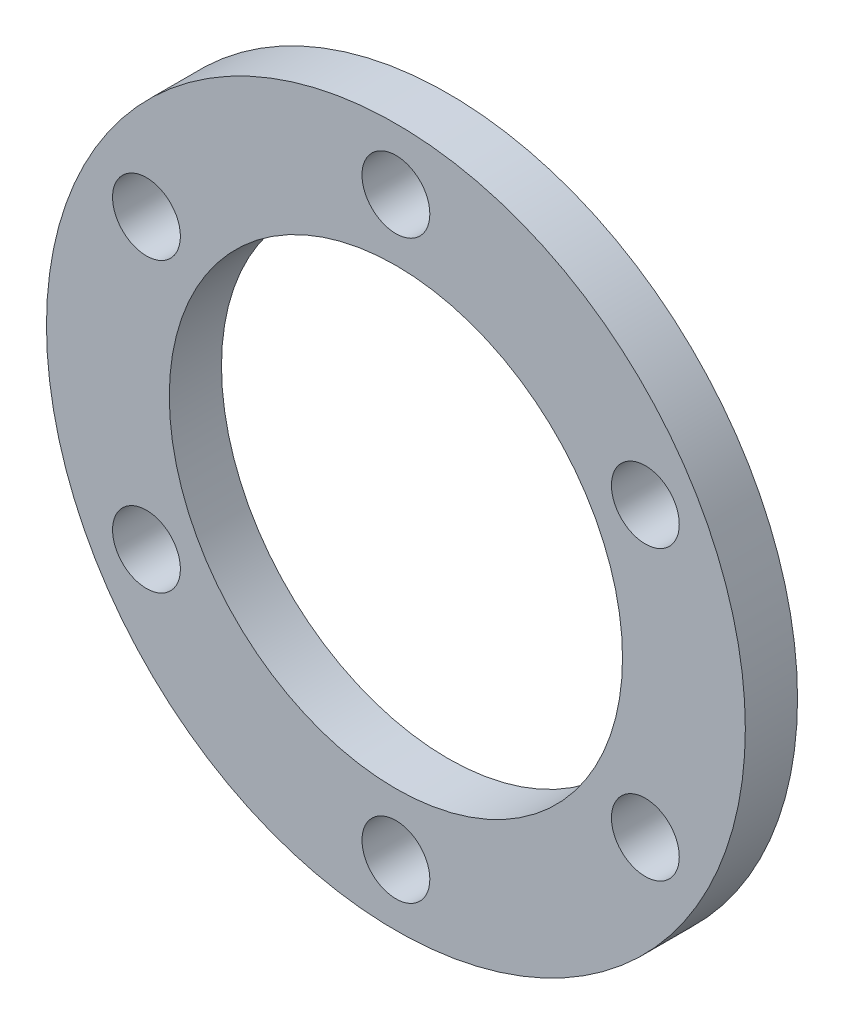
ISO-10303-21;
HEADER;
FILE_DESCRIPTION(('STEP AP214'),'2;1');
FILE_NAME('part.step','',(''),(''),'','','');
FILE_SCHEMA(('AUTOMOTIVE_DESIGN { 1 0 10303 214 1 1 1 1 }'));
ENDSEC;
DATA;
#1=APPLICATION_CONTEXT('core data for automotive mechanical design processes');
#2=APPLICATION_PROTOCOL_DEFINITION('international standard','automotive_design',2000,#1);
#3=PRODUCT_CONTEXT('',#1,'mechanical');
#4=PRODUCT('Part','Part','',(#3));
#5=PRODUCT_RELATED_PRODUCT_CATEGORY('part','',(#4));
#6=PRODUCT_DEFINITION_FORMATION('','',#4);
#7=PRODUCT_DEFINITION_CONTEXT('part definition',#1,'design');
#8=PRODUCT_DEFINITION('design','',#6,#7);
#9=PRODUCT_DEFINITION_SHAPE('','',#8);
#10=(LENGTH_UNIT() NAMED_UNIT(*) SI_UNIT(.MILLI.,.METRE.));
#11=(NAMED_UNIT(*) PLANE_ANGLE_UNIT() SI_UNIT($,.RADIAN.));
#12=(NAMED_UNIT(*) SI_UNIT($,.STERADIAN.) SOLID_ANGLE_UNIT());
#13=UNCERTAINTY_MEASURE_WITH_UNIT(LENGTH_MEASURE(1.E-05),#10,'distance_accuracy_value','');
#14=(GEOMETRIC_REPRESENTATION_CONTEXT(3) GLOBAL_UNCERTAINTY_ASSIGNED_CONTEXT((#13)) GLOBAL_UNIT_ASSIGNED_CONTEXT((#10,
#11,#12)) REPRESENTATION_CONTEXT('',''));
#15=CARTESIAN_POINT('',(0.,0.,0.));
#16=DIRECTION('',(0.,0.,1.));
#17=DIRECTION('',(1.,0.,0.));
#18=AXIS2_PLACEMENT_3D('',#15,#16,#17);
#19=CARTESIAN_POINT('',(0.,0.,4.318));
#20=DIRECTION('',(0.,0.,1.));
#21=DIRECTION('',(1.,0.,0.));
#22=AXIS2_PLACEMENT_3D('',#19,#20,#21);
#23=PLANE('',#22);
#24=CARTESIAN_POINT('',(-20.6332284502443,11.9125999999988,4.318));
#25=DIRECTION('',(0.,0.,1.));
#26=DIRECTION('',(1.,0.,0.));
#27=AXIS2_PLACEMENT_3D('',#24,#25,#26);
#28=CIRCLE('',#27,2.8067);
#29=CARTESIAN_POINT('',(-17.8265284502443,11.9125999999988,4.318));
#30=VERTEX_POINT('',#29);
#31=EDGE_CURVE('E72',#30,#30,#28,.T.);
#32=ORIENTED_EDGE('',*,*,#31,.F.);
#33=EDGE_LOOP('',(#32));
#34=FACE_BOUND('',#33,.T.);
#35=CARTESIAN_POINT('',(2.70277615510124E-12,-23.8252,4.318));
#36=DIRECTION('',(0.,0.,1.));
#37=DIRECTION('',(1.,0.,0.));
#38=AXIS2_PLACEMENT_3D('',#35,#36,#37);
#39=CIRCLE('',#38,2.8067);
#40=CARTESIAN_POINT('',(2.8067000000027,-23.8252,4.318));
#41=VERTEX_POINT('',#40);
#42=EDGE_CURVE('E60',#41,#41,#39,.T.);
#43=ORIENTED_EDGE('',*,*,#42,.F.);
#44=EDGE_LOOP('',(#43));
#45=FACE_BOUND('',#44,.T.);
#46=CARTESIAN_POINT('',(20.6332284502457,11.9126000000012,4.318));
#47=DIRECTION('',(0.,0.,1.));
#48=DIRECTION('',(1.,0.,0.));
#49=AXIS2_PLACEMENT_3D('',#46,#47,#48);
#50=CIRCLE('',#49,2.8067);
#51=CARTESIAN_POINT('',(23.4399284502457,11.9126000000012,4.318));
#52=VERTEX_POINT('',#51);
#53=EDGE_CURVE('E48',#52,#52,#50,.T.);
#54=ORIENTED_EDGE('',*,*,#53,.F.);
#55=EDGE_LOOP('',(#54));
#56=FACE_BOUND('',#55,.T.);
#57=CARTESIAN_POINT('',(0.,0.,4.318));
#58=DIRECTION('',(0.,0.,1.));
#59=DIRECTION('',(1.,0.,0.));
#60=AXIS2_PLACEMENT_3D('',#57,#58,#59);
#61=CIRCLE('',#60,28.9052);
#62=CARTESIAN_POINT('',(28.9052,0.,4.318));
#63=VERTEX_POINT('',#62);
#64=EDGE_CURVE('E10',#63,#63,#61,.T.);
#65=ORIENTED_EDGE('',*,*,#64,.T.);
#66=EDGE_LOOP('',(#65));
#67=FACE_BOUND('',#66,.T.);
#68=CARTESIAN_POINT('',(0.,23.8252,4.318));
#69=DIRECTION('',(0.,0.,1.));
#70=DIRECTION('',(1.,0.,0.));
#71=AXIS2_PLACEMENT_3D('',#68,#69,#70);
#72=CIRCLE('',#71,2.8067);
#73=CARTESIAN_POINT('',(2.8067,23.8252,4.318));
#74=VERTEX_POINT('',#73);
#75=EDGE_CURVE('E43',#74,#74,#72,.T.);
#76=ORIENTED_EDGE('',*,*,#75,.F.);
#77=EDGE_LOOP('',(#76));
#78=FACE_BOUND('',#77,.T.);
#79=CARTESIAN_POINT('',(20.633228450247,-11.9125999999988,4.318));
#80=DIRECTION('',(0.,0.,1.));
#81=DIRECTION('',(1.,0.,0.));
#82=AXIS2_PLACEMENT_3D('',#79,#80,#81);
#83=CIRCLE('',#82,2.8067);
#84=CARTESIAN_POINT('',(23.439928450247,-11.9125999999988,4.318));
#85=VERTEX_POINT('',#84);
#86=EDGE_CURVE('E54',#85,#85,#83,.T.);
#87=ORIENTED_EDGE('',*,*,#86,.F.);
#88=EDGE_LOOP('',(#87));
#89=FACE_BOUND('',#88,.T.);
#90=CARTESIAN_POINT('',(-20.633228450243,-11.9126000000012,4.318));
#91=DIRECTION('',(0.,0.,1.));
#92=DIRECTION('',(1.,0.,0.));
#93=AXIS2_PLACEMENT_3D('',#90,#91,#92);
#94=CIRCLE('',#93,2.8067);
#95=CARTESIAN_POINT('',(-17.826528450243,-11.9126000000012,4.318));
#96=VERTEX_POINT('',#95);
#97=EDGE_CURVE('E66',#96,#96,#94,.T.);
#98=ORIENTED_EDGE('',*,*,#97,.F.);
#99=EDGE_LOOP('',(#98));
#100=FACE_BOUND('',#99,.T.);
#101=CARTESIAN_POINT('',(0.,0.,4.318));
#102=DIRECTION('',(0.,0.,1.));
#103=DIRECTION('',(1.,0.,0.));
#104=AXIS2_PLACEMENT_3D('',#101,#102,#103);
#105=CIRCLE('',#104,18.7452);
#106=CARTESIAN_POINT('',(18.7452,0.,4.318));
#107=VERTEX_POINT('',#106);
#108=EDGE_CURVE('E78',#107,#107,#105,.T.);
#109=ORIENTED_EDGE('',*,*,#108,.F.);
#110=EDGE_LOOP('',(#109));
#111=FACE_BOUND('',#110,.T.);
#112=ADVANCED_FACE('F32',(#34,#45,#56,#67,#78,#89,#100,#111),#23,.T.);
#113=CARTESIAN_POINT('',(0.,0.,0.));
#114=DIRECTION('',(0.,0.,1.));
#115=DIRECTION('',(1.,0.,0.));
#116=AXIS2_PLACEMENT_3D('',#113,#114,#115);
#117=PLANE('',#116);
#118=CARTESIAN_POINT('',(0.,0.,0.));
#119=DIRECTION('',(0.,0.,1.));
#120=DIRECTION('',(1.,0.,0.));
#121=AXIS2_PLACEMENT_3D('',#118,#119,#120);
#122=CIRCLE('',#121,28.9052);
#123=CARTESIAN_POINT('',(28.9052,0.,0.));
#124=VERTEX_POINT('',#123);
#125=EDGE_CURVE('E36',#124,#124,#122,.T.);
#126=ORIENTED_EDGE('',*,*,#125,.F.);
#127=EDGE_LOOP('',(#126));
#128=FACE_BOUND('',#127,.T.);
#129=CARTESIAN_POINT('',(0.,23.8252,0.));
#130=DIRECTION('',(0.,0.,1.));
#131=DIRECTION('',(1.,0.,0.));
#132=AXIS2_PLACEMENT_3D('',#129,#130,#131);
#133=CIRCLE('',#132,2.8067);
#134=CARTESIAN_POINT('',(2.8067,23.8252,0.));
#135=VERTEX_POINT('',#134);
#136=EDGE_CURVE('E45',#135,#135,#133,.T.);
#137=ORIENTED_EDGE('',*,*,#136,.T.);
#138=EDGE_LOOP('',(#137));
#139=FACE_BOUND('',#138,.T.);
#140=CARTESIAN_POINT('',(20.6332284502457,11.9126000000012,0.));
#141=DIRECTION('',(0.,0.,1.));
#142=DIRECTION('',(1.,0.,0.));
#143=AXIS2_PLACEMENT_3D('',#140,#141,#142);
#144=CIRCLE('',#143,2.8067);
#145=CARTESIAN_POINT('',(23.4399284502457,11.9126000000012,0.));
#146=VERTEX_POINT('',#145);
#147=EDGE_CURVE('E51',#146,#146,#144,.T.);
#148=ORIENTED_EDGE('',*,*,#147,.T.);
#149=EDGE_LOOP('',(#148));
#150=FACE_BOUND('',#149,.T.);
#151=CARTESIAN_POINT('',(20.633228450247,-11.9125999999988,0.));
#152=DIRECTION('',(0.,0.,1.));
#153=DIRECTION('',(1.,0.,0.));
#154=AXIS2_PLACEMENT_3D('',#151,#152,#153);
#155=CIRCLE('',#154,2.8067);
#156=CARTESIAN_POINT('',(23.439928450247,-11.9125999999988,0.));
#157=VERTEX_POINT('',#156);
#158=EDGE_CURVE('E57',#157,#157,#155,.T.);
#159=ORIENTED_EDGE('',*,*,#158,.T.);
#160=EDGE_LOOP('',(#159));
#161=FACE_BOUND('',#160,.T.);
#162=CARTESIAN_POINT('',(2.70277615510124E-12,-23.8252,0.));
#163=DIRECTION('',(0.,0.,1.));
#164=DIRECTION('',(1.,0.,0.));
#165=AXIS2_PLACEMENT_3D('',#162,#163,#164);
#166=CIRCLE('',#165,2.8067);
#167=CARTESIAN_POINT('',(2.8067000000027,-23.8252,0.));
#168=VERTEX_POINT('',#167);
#169=EDGE_CURVE('E63',#168,#168,#166,.T.);
#170=ORIENTED_EDGE('',*,*,#169,.T.);
#171=EDGE_LOOP('',(#170));
#172=FACE_BOUND('',#171,.T.);
#173=CARTESIAN_POINT('',(-20.633228450243,-11.9126000000012,0.));
#174=DIRECTION('',(0.,0.,1.));
#175=DIRECTION('',(1.,0.,0.));
#176=AXIS2_PLACEMENT_3D('',#173,#174,#175);
#177=CIRCLE('',#176,2.8067);
#178=CARTESIAN_POINT('',(-17.826528450243,-11.9126000000012,0.));
#179=VERTEX_POINT('',#178);
#180=EDGE_CURVE('E69',#179,#179,#177,.T.);
#181=ORIENTED_EDGE('',*,*,#180,.T.);
#182=EDGE_LOOP('',(#181));
#183=FACE_BOUND('',#182,.T.);
#184=CARTESIAN_POINT('',(-20.6332284502443,11.9125999999988,0.));
#185=DIRECTION('',(0.,0.,1.));
#186=DIRECTION('',(1.,0.,0.));
#187=AXIS2_PLACEMENT_3D('',#184,#185,#186);
#188=CIRCLE('',#187,2.8067);
#189=CARTESIAN_POINT('',(-17.8265284502443,11.9125999999988,0.));
#190=VERTEX_POINT('',#189);
#191=EDGE_CURVE('E75',#190,#190,#188,.T.);
#192=ORIENTED_EDGE('',*,*,#191,.T.);
#193=EDGE_LOOP('',(#192));
#194=FACE_BOUND('',#193,.T.);
#195=CARTESIAN_POINT('',(0.,0.,0.));
#196=DIRECTION('',(0.,0.,1.));
#197=DIRECTION('',(1.,0.,0.));
#198=AXIS2_PLACEMENT_3D('',#195,#196,#197);
#199=CIRCLE('',#198,18.7452);
#200=CARTESIAN_POINT('',(18.7452,0.,0.));
#201=VERTEX_POINT('',#200);
#202=EDGE_CURVE('E81',#201,#201,#199,.T.);
#203=ORIENTED_EDGE('',*,*,#202,.T.);
#204=EDGE_LOOP('',(#203));
#205=FACE_BOUND('',#204,.T.);
#206=ADVANCED_FACE('F91',(#128,#139,#150,#161,#172,#183,#194,#205),#117,.F.);
#207=CARTESIAN_POINT('',(0.,0.,4.318));
#208=DIRECTION('',(0.,0.,-1.));
#209=DIRECTION('',(-1.,0.,0.));
#210=AXIS2_PLACEMENT_3D('',#207,#208,#209);
#211=CYLINDRICAL_SURFACE('',#210,28.9052);
#212=ORIENTED_EDGE('',*,*,#64,.F.);
#213=EDGE_LOOP('',(#212));
#214=FACE_BOUND('',#213,.T.);
#215=ORIENTED_EDGE('',*,*,#125,.T.);
#216=EDGE_LOOP('',(#215));
#217=FACE_BOUND('',#216,.T.);
#218=ADVANCED_FACE('F34',(#214,#217),#211,.T.);
#219=CARTESIAN_POINT('',(0.,23.8252,4.318));
#220=DIRECTION('',(0.,0.,-1.));
#221=DIRECTION('',(-1.,0.,0.));
#222=AXIS2_PLACEMENT_3D('',#219,#220,#221);
#223=CYLINDRICAL_SURFACE('',#222,2.8067);
#224=ORIENTED_EDGE('',*,*,#75,.T.);
#225=EDGE_LOOP('',(#224));
#226=FACE_BOUND('',#225,.T.);
#227=ORIENTED_EDGE('',*,*,#136,.F.);
#228=EDGE_LOOP('',(#227));
#229=FACE_BOUND('',#228,.T.);
#230=ADVANCED_FACE('F101',(#226,#229),#223,.F.);
#231=CARTESIAN_POINT('',(20.6332284502457,11.9126000000012,4.318));
#232=DIRECTION('',(0.,0.,-1.));
#233=DIRECTION('',(-1.,0.,0.));
#234=AXIS2_PLACEMENT_3D('',#231,#232,#233);
#235=CYLINDRICAL_SURFACE('',#234,2.8067);
#236=ORIENTED_EDGE('',*,*,#53,.T.);
#237=EDGE_LOOP('',(#236));
#238=FACE_BOUND('',#237,.T.);
#239=ORIENTED_EDGE('',*,*,#147,.F.);
#240=EDGE_LOOP('',(#239));
#241=FACE_BOUND('',#240,.T.);
#242=ADVANCED_FACE('F104',(#238,#241),#235,.F.);
#243=CARTESIAN_POINT('',(20.633228450247,-11.9125999999988,4.318));
#244=DIRECTION('',(0.,0.,-1.));
#245=DIRECTION('',(-1.,0.,0.));
#246=AXIS2_PLACEMENT_3D('',#243,#244,#245);
#247=CYLINDRICAL_SURFACE('',#246,2.8067);
#248=ORIENTED_EDGE('',*,*,#86,.T.);
#249=EDGE_LOOP('',(#248));
#250=FACE_BOUND('',#249,.T.);
#251=ORIENTED_EDGE('',*,*,#158,.F.);
#252=EDGE_LOOP('',(#251));
#253=FACE_BOUND('',#252,.T.);
#254=ADVANCED_FACE('F108',(#250,#253),#247,.F.);
#255=CARTESIAN_POINT('',(2.70277615510124E-12,-23.8252,4.318));
#256=DIRECTION('',(0.,0.,-1.));
#257=DIRECTION('',(-1.,0.,0.));
#258=AXIS2_PLACEMENT_3D('',#255,#256,#257);
#259=CYLINDRICAL_SURFACE('',#258,2.8067);
#260=ORIENTED_EDGE('',*,*,#42,.T.);
#261=EDGE_LOOP('',(#260));
#262=FACE_BOUND('',#261,.T.);
#263=ORIENTED_EDGE('',*,*,#169,.F.);
#264=EDGE_LOOP('',(#263));
#265=FACE_BOUND('',#264,.T.);
#266=ADVANCED_FACE('F112',(#262,#265),#259,.F.);
#267=CARTESIAN_POINT('',(-20.633228450243,-11.9126000000012,4.318));
#268=DIRECTION('',(0.,0.,-1.));
#269=DIRECTION('',(-1.,0.,0.));
#270=AXIS2_PLACEMENT_3D('',#267,#268,#269);
#271=CYLINDRICAL_SURFACE('',#270,2.8067);
#272=ORIENTED_EDGE('',*,*,#97,.T.);
#273=EDGE_LOOP('',(#272));
#274=FACE_BOUND('',#273,.T.);
#275=ORIENTED_EDGE('',*,*,#180,.F.);
#276=EDGE_LOOP('',(#275));
#277=FACE_BOUND('',#276,.T.);
#278=ADVANCED_FACE('F116',(#274,#277),#271,.F.);
#279=CARTESIAN_POINT('',(-20.6332284502443,11.9125999999988,4.318));
#280=DIRECTION('',(0.,0.,-1.));
#281=DIRECTION('',(-1.,0.,0.));
#282=AXIS2_PLACEMENT_3D('',#279,#280,#281);
#283=CYLINDRICAL_SURFACE('',#282,2.8067);
#284=ORIENTED_EDGE('',*,*,#31,.T.);
#285=EDGE_LOOP('',(#284));
#286=FACE_BOUND('',#285,.T.);
#287=ORIENTED_EDGE('',*,*,#191,.F.);
#288=EDGE_LOOP('',(#287));
#289=FACE_BOUND('',#288,.T.);
#290=ADVANCED_FACE('F120',(#286,#289),#283,.F.);
#291=CARTESIAN_POINT('',(0.,0.,4.318));
#292=DIRECTION('',(0.,0.,-1.));
#293=DIRECTION('',(-1.,0.,0.));
#294=AXIS2_PLACEMENT_3D('',#291,#292,#293);
#295=CYLINDRICAL_SURFACE('',#294,18.7452);
#296=ORIENTED_EDGE('',*,*,#108,.T.);
#297=EDGE_LOOP('',(#296));
#298=FACE_BOUND('',#297,.T.);
#299=ORIENTED_EDGE('',*,*,#202,.F.);
#300=EDGE_LOOP('',(#299));
#301=FACE_BOUND('',#300,.T.);
#302=ADVANCED_FACE('F87',(#298,#301),#295,.F.);
#303=CLOSED_SHELL('',(#112,#206,#218,#230,#242,#254,#266,#278,#290,#302));
#304=MANIFOLD_SOLID_BREP('B2',#303);
#305=ADVANCED_BREP_SHAPE_REPRESENTATION('',(#18,#304),#14);
#306=SHAPE_DEFINITION_REPRESENTATION(#9,#305);
ENDSEC;
END-ISO-10303-21;
